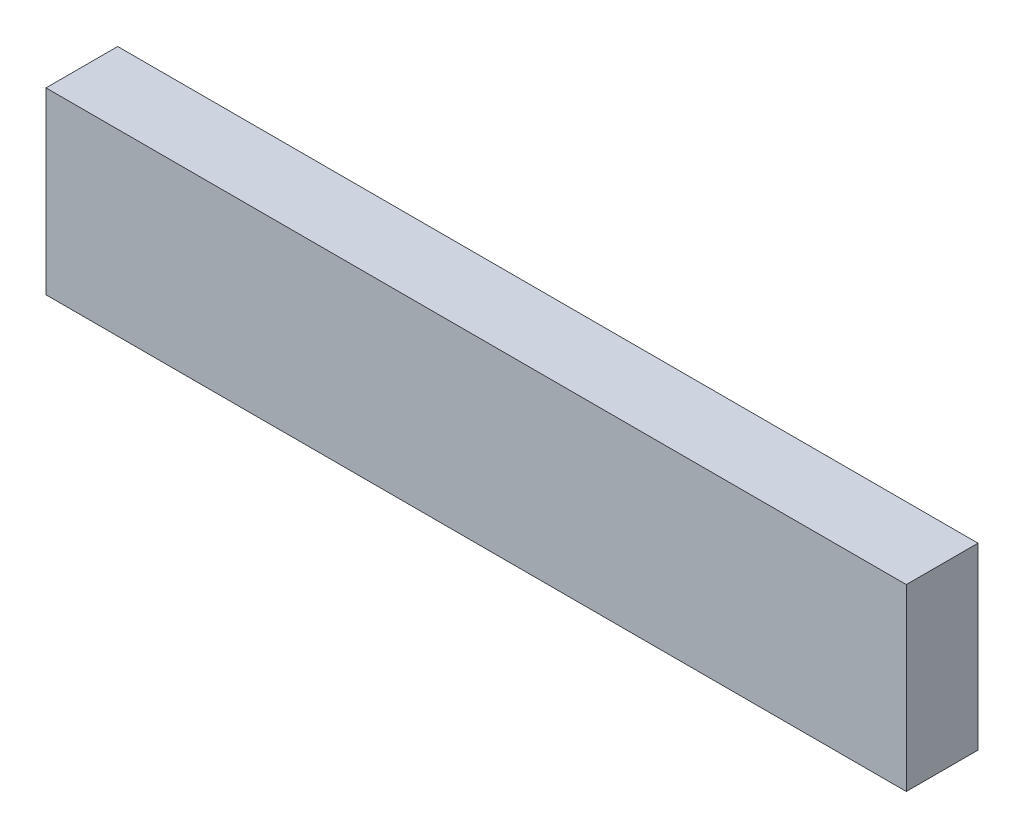
ISO-10303-21;
HEADER;
FILE_DESCRIPTION(('STEP AP214'),'2;1');
FILE_NAME('part.step','',(''),(''),'','','');
FILE_SCHEMA(('AUTOMOTIVE_DESIGN { 1 0 10303 214 1 1 1 1 }'));
ENDSEC;
DATA;
#1=APPLICATION_CONTEXT('core data for automotive mechanical design processes');
#2=APPLICATION_PROTOCOL_DEFINITION('international standard','automotive_design',2000,#1);
#3=PRODUCT_CONTEXT('',#1,'mechanical');
#4=PRODUCT('Part','Part','',(#3));
#5=PRODUCT_RELATED_PRODUCT_CATEGORY('part','',(#4));
#6=PRODUCT_DEFINITION_FORMATION('','',#4);
#7=PRODUCT_DEFINITION_CONTEXT('part definition',#1,'design');
#8=PRODUCT_DEFINITION('design','',#6,#7);
#9=PRODUCT_DEFINITION_SHAPE('','',#8);
#10=(LENGTH_UNIT() NAMED_UNIT(*) SI_UNIT(.MILLI.,.METRE.));
#11=(NAMED_UNIT(*) PLANE_ANGLE_UNIT() SI_UNIT($,.RADIAN.));
#12=(NAMED_UNIT(*) SI_UNIT($,.STERADIAN.) SOLID_ANGLE_UNIT());
#13=UNCERTAINTY_MEASURE_WITH_UNIT(LENGTH_MEASURE(1.E-05),#10,'distance_accuracy_value','');
#14=(GEOMETRIC_REPRESENTATION_CONTEXT(3) GLOBAL_UNCERTAINTY_ASSIGNED_CONTEXT((#13)) GLOBAL_UNIT_ASSIGNED_CONTEXT((#10,
#11,#12)) REPRESENTATION_CONTEXT('',''));
#15=CARTESIAN_POINT('',(0.,0.,0.));
#16=DIRECTION('',(0.,0.,1.));
#17=DIRECTION('',(1.,0.,0.));
#18=AXIS2_PLACEMENT_3D('',#15,#16,#17);
#19=CARTESIAN_POINT('',(0.,0.,303.997677706789));
#20=DIRECTION('',(0.,0.,1.));
#21=DIRECTION('',(1.,0.,0.));
#22=AXIS2_PLACEMENT_3D('',#19,#20,#21);
#23=PLANE('',#22);
#24=DIRECTION('',(0.,-1.,0.));
#25=VECTOR('',#24,1.);
#26=CARTESIAN_POINT('',(191.308851424871,77.0329435138107,303.997677706789));
#27=LINE('',#26,#25);
#28=CARTESIAN_POINT('',(191.308851424871,77.0329435138107,303.997677706789));
#29=VERTEX_POINT('',#28);
#30=CARTESIAN_POINT('',(191.308851424871,67.0329435138107,303.997677706789));
#31=VERTEX_POINT('',#30);
#32=EDGE_CURVE('E80',#29,#31,#27,.T.);
#33=ORIENTED_EDGE('',*,*,#32,.T.);
#34=DIRECTION('',(1.,0.,0.));
#35=VECTOR('',#34,1.);
#36=CARTESIAN_POINT('',(191.308851424871,67.0329435138107,303.997677706789));
#37=LINE('',#36,#35);
#38=CARTESIAN_POINT('',(239.308851424871,67.0329435138107,303.997677706789));
#39=VERTEX_POINT('',#38);
#40=EDGE_CURVE('E76',#31,#39,#37,.T.);
#41=ORIENTED_EDGE('',*,*,#40,.T.);
#42=DIRECTION('',(0.,1.,0.));
#43=VECTOR('',#42,1.);
#44=CARTESIAN_POINT('',(239.308851424871,77.0329435138107,303.997677706789));
#45=LINE('',#44,#43);
#46=CARTESIAN_POINT('',(239.308851424871,77.0329435138107,303.997677706789));
#47=VERTEX_POINT('',#46);
#48=EDGE_CURVE('E78',#39,#47,#45,.T.);
#49=ORIENTED_EDGE('',*,*,#48,.T.);
#50=DIRECTION('',(-1.,0.,0.));
#51=VECTOR('',#50,1.);
#52=CARTESIAN_POINT('',(191.308851424871,77.0329435138107,303.997677706789));
#53=LINE('',#52,#51);
#54=EDGE_CURVE('E50',#47,#29,#53,.T.);
#55=ORIENTED_EDGE('',*,*,#54,.T.);
#56=EDGE_LOOP('',(#33,#41,#49,#55));
#57=FACE_BOUND('',#56,.T.);
#58=ADVANCED_FACE('F33',(#57),#23,.T.);
#59=CARTESIAN_POINT('',(191.308851424871,77.0329435138107,303.997677706789));
#60=DIRECTION('',(0.,-1.,0.));
#61=DIRECTION('',(0.,0.,-1.));
#62=AXIS2_PLACEMENT_3D('',#59,#60,#61);
#63=PLANE('',#62);
#64=DIRECTION('',(-1.,0.,0.));
#65=VECTOR('',#64,1.);
#66=CARTESIAN_POINT('',(191.308851424871,77.0329435138107,299.997677706789));
#67=LINE('',#66,#65);
#68=CARTESIAN_POINT('',(239.308851424871,77.0329435138107,299.997677706789));
#69=VERTEX_POINT('',#68);
#70=CARTESIAN_POINT('',(191.308851424871,77.0329435138107,299.997677706789));
#71=VERTEX_POINT('',#70);
#72=EDGE_CURVE('E95',#69,#71,#67,.T.);
#73=ORIENTED_EDGE('',*,*,#72,.T.);
#74=DIRECTION('',(0.,0.,-1.));
#75=VECTOR('',#74,1.);
#76=CARTESIAN_POINT('',(191.308851424871,77.0329435138107,303.997677706789));
#77=LINE('',#76,#75);
#78=EDGE_CURVE('E90',#29,#71,#77,.T.);
#79=ORIENTED_EDGE('',*,*,#78,.F.);
#80=ORIENTED_EDGE('',*,*,#54,.F.);
#81=DIRECTION('',(0.,0.,-1.));
#82=VECTOR('',#81,1.);
#83=CARTESIAN_POINT('',(239.308851424871,77.0329435138107,303.997677706789));
#84=LINE('',#83,#82);
#85=EDGE_CURVE('E85',#47,#69,#84,.T.);
#86=ORIENTED_EDGE('',*,*,#85,.T.);
#87=EDGE_LOOP('',(#73,#79,#80,#86));
#88=FACE_BOUND('',#87,.T.);
#89=ADVANCED_FACE('F107',(#88),#63,.F.);
#90=CARTESIAN_POINT('',(239.308851424871,77.0329435138107,303.997677706789));
#91=DIRECTION('',(-1.,0.,0.));
#92=DIRECTION('',(0.,0.,1.));
#93=AXIS2_PLACEMENT_3D('',#90,#91,#92);
#94=PLANE('',#93);
#95=DIRECTION('',(0.,1.,0.));
#96=VECTOR('',#95,1.);
#97=CARTESIAN_POINT('',(239.308851424871,77.0329435138107,299.997677706789));
#98=LINE('',#97,#96);
#99=CARTESIAN_POINT('',(239.308851424871,67.0329435138107,299.997677706789));
#100=VERTEX_POINT('',#99);
#101=EDGE_CURVE('E70',#100,#69,#98,.T.);
#102=ORIENTED_EDGE('',*,*,#101,.T.);
#103=ORIENTED_EDGE('',*,*,#85,.F.);
#104=ORIENTED_EDGE('',*,*,#48,.F.);
#105=DIRECTION('',(0.,0.,-1.));
#106=VECTOR('',#105,1.);
#107=CARTESIAN_POINT('',(239.308851424871,67.0329435138107,303.997677706789));
#108=LINE('',#107,#106);
#109=EDGE_CURVE('E83',#39,#100,#108,.T.);
#110=ORIENTED_EDGE('',*,*,#109,.T.);
#111=EDGE_LOOP('',(#102,#103,#104,#110));
#112=FACE_BOUND('',#111,.T.);
#113=ADVANCED_FACE('F87',(#112),#94,.F.);
#114=CARTESIAN_POINT('',(191.308851424871,67.0329435138107,303.997677706789));
#115=DIRECTION('',(0.,1.,0.));
#116=DIRECTION('',(0.,0.,1.));
#117=AXIS2_PLACEMENT_3D('',#114,#115,#116);
#118=PLANE('',#117);
#119=DIRECTION('',(1.,0.,0.));
#120=VECTOR('',#119,1.);
#121=CARTESIAN_POINT('',(191.308851424871,67.0329435138107,299.997677706789));
#122=LINE('',#121,#120);
#123=CARTESIAN_POINT('',(191.308851424871,67.0329435138107,299.997677706789));
#124=VERTEX_POINT('',#123);
#125=EDGE_CURVE('E11',#124,#100,#122,.T.);
#126=ORIENTED_EDGE('',*,*,#125,.T.);
#127=ORIENTED_EDGE('',*,*,#109,.F.);
#128=ORIENTED_EDGE('',*,*,#40,.F.);
#129=DIRECTION('',(0.,0.,-1.));
#130=VECTOR('',#129,1.);
#131=CARTESIAN_POINT('',(191.308851424871,67.0329435138107,303.997677706789));
#132=LINE('',#131,#130);
#133=EDGE_CURVE('E42',#31,#124,#132,.T.);
#134=ORIENTED_EDGE('',*,*,#133,.T.);
#135=EDGE_LOOP('',(#126,#127,#128,#134));
#136=FACE_BOUND('',#135,.T.);
#137=ADVANCED_FACE('F84',(#136),#118,.F.);
#138=CARTESIAN_POINT('',(0.,0.,299.997677706789));
#139=DIRECTION('',(0.,0.,1.));
#140=DIRECTION('',(1.,0.,0.));
#141=AXIS2_PLACEMENT_3D('',#138,#139,#140);
#142=PLANE('',#141);
#143=ORIENTED_EDGE('',*,*,#101,.F.);
#144=ORIENTED_EDGE('',*,*,#125,.F.);
#145=DIRECTION('',(0.,-1.,0.));
#146=VECTOR('',#145,1.);
#147=CARTESIAN_POINT('',(191.308851424871,77.0329435138107,299.997677706789));
#148=LINE('',#147,#146);
#149=EDGE_CURVE('E96',#71,#124,#148,.T.);
#150=ORIENTED_EDGE('',*,*,#149,.F.);
#151=ORIENTED_EDGE('',*,*,#72,.F.);
#152=EDGE_LOOP('',(#143,#144,#150,#151));
#153=FACE_BOUND('',#152,.T.);
#154=ADVANCED_FACE('F105',(#153),#142,.F.);
#155=CARTESIAN_POINT('',(191.308851424871,78.5393273345444,251.933803965415));
#156=DIRECTION('',(-1.,0.,0.));
#157=DIRECTION('',(0.,-1.,0.));
#158=AXIS2_PLACEMENT_3D('',#155,#156,#157);
#159=PLANE('',#158);
#160=ORIENTED_EDGE('',*,*,#149,.T.);
#161=ORIENTED_EDGE('',*,*,#133,.F.);
#162=ORIENTED_EDGE('',*,*,#32,.F.);
#163=ORIENTED_EDGE('',*,*,#78,.T.);
#164=EDGE_LOOP('',(#160,#161,#162,#163));
#165=FACE_BOUND('',#164,.T.);
#166=ADVANCED_FACE('F35',(#165),#159,.T.);
#167=CLOSED_SHELL('',(#58,#89,#113,#137,#154,#166));
#168=MANIFOLD_SOLID_BREP('B2',#167);
#169=ADVANCED_BREP_SHAPE_REPRESENTATION('',(#18,#168),#14);
#170=SHAPE_DEFINITION_REPRESENTATION(#9,#169);
ENDSEC;
END-ISO-10303-21;
